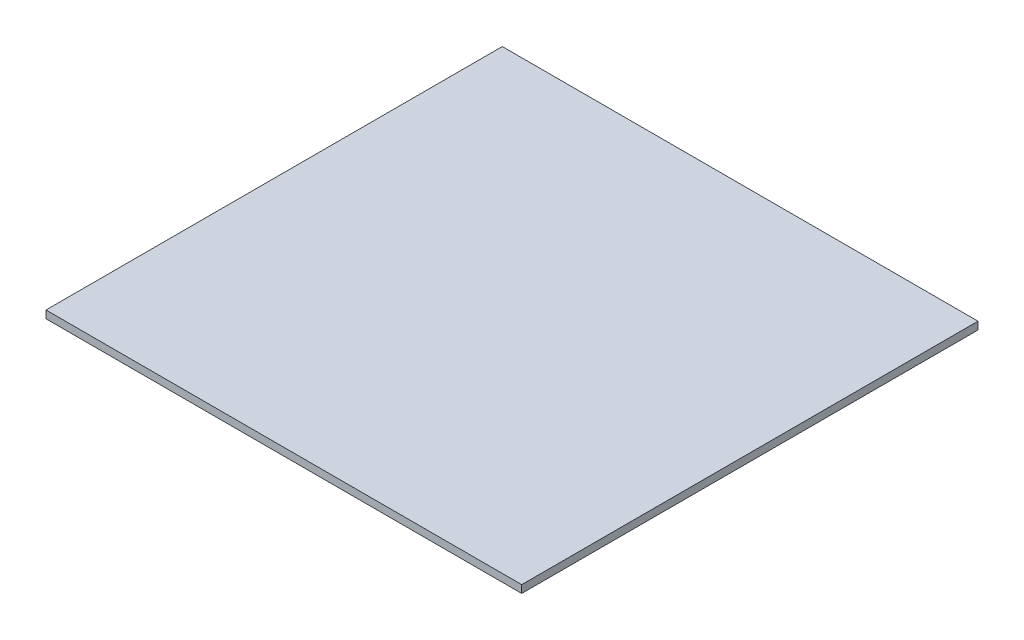
ISO-10303-21;
HEADER;
FILE_DESCRIPTION(('STEP AP214'),'2;1');
FILE_NAME('part.step','',(''),(''),'','','');
FILE_SCHEMA(('AUTOMOTIVE_DESIGN { 1 0 10303 214 1 1 1 1 }'));
ENDSEC;
DATA;
#1=APPLICATION_CONTEXT('core data for automotive mechanical design processes');
#2=APPLICATION_PROTOCOL_DEFINITION('international standard','automotive_design',2000,#1);
#3=PRODUCT_CONTEXT('',#1,'mechanical');
#4=PRODUCT('Part','Part','',(#3));
#5=PRODUCT_RELATED_PRODUCT_CATEGORY('part','',(#4));
#6=PRODUCT_DEFINITION_FORMATION('','',#4);
#7=PRODUCT_DEFINITION_CONTEXT('part definition',#1,'design');
#8=PRODUCT_DEFINITION('design','',#6,#7);
#9=PRODUCT_DEFINITION_SHAPE('','',#8);
#10=(LENGTH_UNIT() NAMED_UNIT(*) SI_UNIT(.MILLI.,.METRE.));
#11=(NAMED_UNIT(*) PLANE_ANGLE_UNIT() SI_UNIT($,.RADIAN.));
#12=(NAMED_UNIT(*) SI_UNIT($,.STERADIAN.) SOLID_ANGLE_UNIT());
#13=UNCERTAINTY_MEASURE_WITH_UNIT(LENGTH_MEASURE(1.E-05),#10,'distance_accuracy_value','');
#14=(GEOMETRIC_REPRESENTATION_CONTEXT(3) GLOBAL_UNCERTAINTY_ASSIGNED_CONTEXT((#13)) GLOBAL_UNIT_ASSIGNED_CONTEXT((#10,
#11,#12)) REPRESENTATION_CONTEXT('',''));
#15=CARTESIAN_POINT('',(0.,0.,0.));
#16=DIRECTION('',(0.,0.,1.));
#17=DIRECTION('',(1.,0.,0.));
#18=AXIS2_PLACEMENT_3D('',#15,#16,#17);
#19=CARTESIAN_POINT('',(0.,1.,0.));
#20=DIRECTION('',(1.,0.,0.));
#21=DIRECTION('',(0.,0.,-1.));
#22=AXIS2_PLACEMENT_3D('',#19,#20,#21);
#23=PLANE('',#22);
#24=DIRECTION('',(0.,0.,1.));
#25=VECTOR('',#24,1.);
#26=CARTESIAN_POINT('',(0.,0.,0.));
#27=LINE('',#26,#25);
#28=CARTESIAN_POINT('',(0.,0.,-59.69));
#29=VERTEX_POINT('',#28);
#30=CARTESIAN_POINT('',(0.,0.,0.));
#31=VERTEX_POINT('',#30);
#32=EDGE_CURVE('E96',#29,#31,#27,.T.);
#33=ORIENTED_EDGE('',*,*,#32,.T.);
#34=DIRECTION('',(0.,-1.,0.));
#35=VECTOR('',#34,1.);
#36=CARTESIAN_POINT('',(0.,1.,0.));
#37=LINE('',#36,#35);
#38=CARTESIAN_POINT('',(0.,1.,0.));
#39=VERTEX_POINT('',#38);
#40=EDGE_CURVE('E11',#39,#31,#37,.T.);
#41=ORIENTED_EDGE('',*,*,#40,.F.);
#42=DIRECTION('',(0.,0.,1.));
#43=VECTOR('',#42,1.);
#44=CARTESIAN_POINT('',(0.,1.,0.));
#45=LINE('',#44,#43);
#46=CARTESIAN_POINT('',(0.,1.,-59.69));
#47=VERTEX_POINT('',#46);
#48=EDGE_CURVE('E84',#47,#39,#45,.T.);
#49=ORIENTED_EDGE('',*,*,#48,.F.);
#50=DIRECTION('',(0.,-1.,0.));
#51=VECTOR('',#50,1.);
#52=CARTESIAN_POINT('',(0.,1.,-59.69));
#53=LINE('',#52,#51);
#54=EDGE_CURVE('E92',#47,#29,#53,.T.);
#55=ORIENTED_EDGE('',*,*,#54,.T.);
#56=EDGE_LOOP('',(#33,#41,#49,#55));
#57=FACE_BOUND('',#56,.T.);
#58=ADVANCED_FACE('F33',(#57),#23,.F.);
#59=CARTESIAN_POINT('',(0.,1.,0.));
#60=DIRECTION('',(0.,0.,-1.));
#61=DIRECTION('',(-1.,0.,0.));
#62=AXIS2_PLACEMENT_3D('',#59,#60,#61);
#63=PLANE('',#62);
#64=DIRECTION('',(1.,0.,0.));
#65=VECTOR('',#64,1.);
#66=CARTESIAN_POINT('',(0.,0.,0.));
#67=LINE('',#66,#65);
#68=CARTESIAN_POINT('',(62.23,0.,0.));
#69=VERTEX_POINT('',#68);
#70=EDGE_CURVE('E88',#31,#69,#67,.T.);
#71=ORIENTED_EDGE('',*,*,#70,.T.);
#72=DIRECTION('',(0.,-1.,0.));
#73=VECTOR('',#72,1.);
#74=CARTESIAN_POINT('',(62.23,1.,0.));
#75=LINE('',#74,#73);
#76=CARTESIAN_POINT('',(62.23,1.,0.));
#77=VERTEX_POINT('',#76);
#78=EDGE_CURVE('E41',#77,#69,#75,.T.);
#79=ORIENTED_EDGE('',*,*,#78,.F.);
#80=DIRECTION('',(1.,0.,0.));
#81=VECTOR('',#80,1.);
#82=CARTESIAN_POINT('',(0.,1.,0.));
#83=LINE('',#82,#81);
#84=EDGE_CURVE('E79',#39,#77,#83,.T.);
#85=ORIENTED_EDGE('',*,*,#84,.F.);
#86=ORIENTED_EDGE('',*,*,#40,.T.);
#87=EDGE_LOOP('',(#71,#79,#85,#86));
#88=FACE_BOUND('',#87,.T.);
#89=ADVANCED_FACE('F87',(#88),#63,.F.);
#90=CARTESIAN_POINT('',(62.23,1.,0.));
#91=DIRECTION('',(-1.,0.,0.));
#92=DIRECTION('',(0.,0.,1.));
#93=AXIS2_PLACEMENT_3D('',#90,#91,#92);
#94=PLANE('',#93);
#95=DIRECTION('',(0.,0.,-1.));
#96=VECTOR('',#95,1.);
#97=CARTESIAN_POINT('',(62.23,0.,0.));
#98=LINE('',#97,#96);
#99=CARTESIAN_POINT('',(62.23,0.,-59.69));
#100=VERTEX_POINT('',#99);
#101=EDGE_CURVE('E66',#69,#100,#98,.T.);
#102=ORIENTED_EDGE('',*,*,#101,.T.);
#103=DIRECTION('',(0.,-1.,0.));
#104=VECTOR('',#103,1.);
#105=CARTESIAN_POINT('',(62.23,1.,-59.69));
#106=LINE('',#105,#104);
#107=CARTESIAN_POINT('',(62.23,1.,-59.69));
#108=VERTEX_POINT('',#107);
#109=EDGE_CURVE('E89',#108,#100,#106,.T.);
#110=ORIENTED_EDGE('',*,*,#109,.F.);
#111=DIRECTION('',(0.,0.,-1.));
#112=VECTOR('',#111,1.);
#113=CARTESIAN_POINT('',(62.23,1.,0.));
#114=LINE('',#113,#112);
#115=EDGE_CURVE('E82',#77,#108,#114,.T.);
#116=ORIENTED_EDGE('',*,*,#115,.F.);
#117=ORIENTED_EDGE('',*,*,#78,.T.);
#118=EDGE_LOOP('',(#102,#110,#116,#117));
#119=FACE_BOUND('',#118,.T.);
#120=ADVANCED_FACE('F90',(#119),#94,.F.);
#121=CARTESIAN_POINT('',(0.,1.,-59.69));
#122=DIRECTION('',(0.,0.,1.));
#123=DIRECTION('',(1.,0.,0.));
#124=AXIS2_PLACEMENT_3D('',#121,#122,#123);
#125=PLANE('',#124);
#126=DIRECTION('',(-1.,0.,0.));
#127=VECTOR('',#126,1.);
#128=CARTESIAN_POINT('',(0.,0.,-59.69));
#129=LINE('',#128,#127);
#130=EDGE_CURVE('E72',#100,#29,#129,.T.);
#131=ORIENTED_EDGE('',*,*,#130,.T.);
#132=ORIENTED_EDGE('',*,*,#54,.F.);
#133=DIRECTION('',(-1.,0.,0.));
#134=VECTOR('',#133,1.);
#135=CARTESIAN_POINT('',(0.,1.,-59.69));
#136=LINE('',#135,#134);
#137=EDGE_CURVE('E49',#108,#47,#136,.T.);
#138=ORIENTED_EDGE('',*,*,#137,.F.);
#139=ORIENTED_EDGE('',*,*,#109,.T.);
#140=EDGE_LOOP('',(#131,#132,#138,#139));
#141=FACE_BOUND('',#140,.T.);
#142=ADVANCED_FACE('F103',(#141),#125,.F.);
#143=CARTESIAN_POINT('',(0.,1.,0.));
#144=DIRECTION('',(0.,-1.,0.));
#145=DIRECTION('',(0.,0.,-1.));
#146=AXIS2_PLACEMENT_3D('',#143,#144,#145);
#147=PLANE('',#146);
#148=ORIENTED_EDGE('',*,*,#48,.T.);
#149=ORIENTED_EDGE('',*,*,#84,.T.);
#150=ORIENTED_EDGE('',*,*,#115,.T.);
#151=ORIENTED_EDGE('',*,*,#137,.T.);
#152=EDGE_LOOP('',(#148,#149,#150,#151));
#153=FACE_BOUND('',#152,.T.);
#154=ADVANCED_FACE('F80',(#153),#147,.F.);
#155=CARTESIAN_POINT('',(0.,0.,0.));
#156=DIRECTION('',(0.,-1.,0.));
#157=DIRECTION('',(0.,0.,-1.));
#158=AXIS2_PLACEMENT_3D('',#155,#156,#157);
#159=PLANE('',#158);
#160=ORIENTED_EDGE('',*,*,#32,.F.);
#161=ORIENTED_EDGE('',*,*,#130,.F.);
#162=ORIENTED_EDGE('',*,*,#101,.F.);
#163=ORIENTED_EDGE('',*,*,#70,.F.);
#164=EDGE_LOOP('',(#160,#161,#162,#163));
#165=FACE_BOUND('',#164,.T.);
#166=ADVANCED_FACE('F106',(#165),#159,.T.);
#167=CLOSED_SHELL('',(#58,#89,#120,#142,#154,#166));
#168=MANIFOLD_SOLID_BREP('B2',#167);
#169=ADVANCED_BREP_SHAPE_REPRESENTATION('',(#18,#168),#14);
#170=SHAPE_DEFINITION_REPRESENTATION(#9,#169);
ENDSEC;
END-ISO-10303-21;
